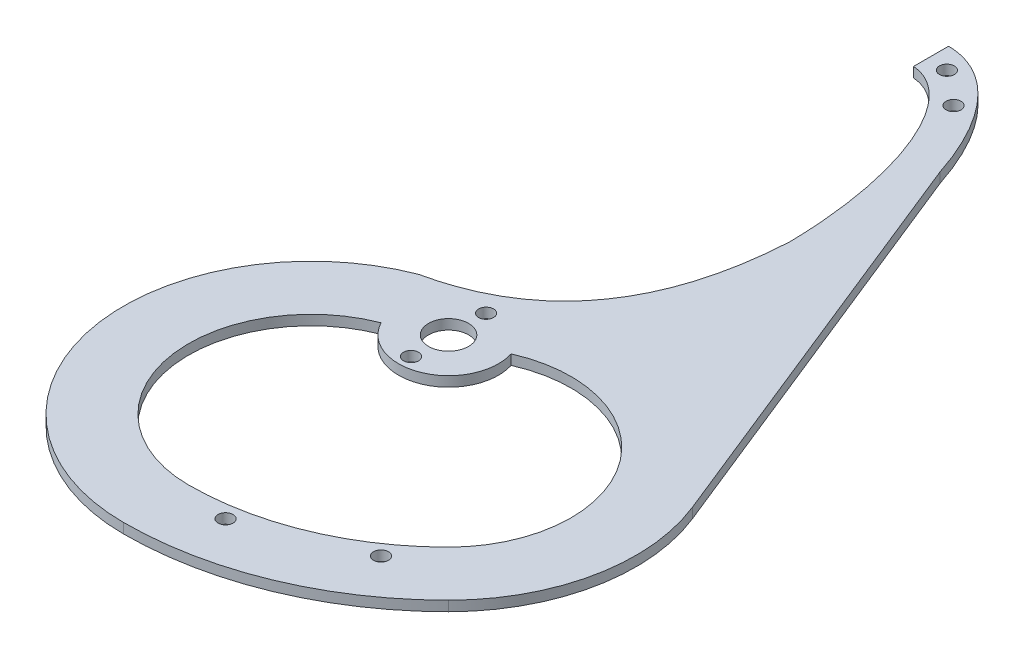
ISO-10303-21;
HEADER;
FILE_DESCRIPTION(('STEP AP214'),'2;1');
FILE_NAME('part.step','',(''),(''),'','','');
FILE_SCHEMA(('AUTOMOTIVE_DESIGN { 1 0 10303 214 1 1 1 1 }'));
ENDSEC;
DATA;
#1=APPLICATION_CONTEXT('core data for automotive mechanical design processes');
#2=APPLICATION_PROTOCOL_DEFINITION('international standard','automotive_design',2000,#1);
#3=PRODUCT_CONTEXT('',#1,'mechanical');
#4=PRODUCT('Part','Part','',(#3));
#5=PRODUCT_RELATED_PRODUCT_CATEGORY('part','',(#4));
#6=PRODUCT_DEFINITION_FORMATION('','',#4);
#7=PRODUCT_DEFINITION_CONTEXT('part definition',#1,'design');
#8=PRODUCT_DEFINITION('design','',#6,#7);
#9=PRODUCT_DEFINITION_SHAPE('','',#8);
#10=(LENGTH_UNIT() NAMED_UNIT(*) SI_UNIT(.MILLI.,.METRE.));
#11=(NAMED_UNIT(*) PLANE_ANGLE_UNIT() SI_UNIT($,.RADIAN.));
#12=(NAMED_UNIT(*) SI_UNIT($,.STERADIAN.) SOLID_ANGLE_UNIT());
#13=UNCERTAINTY_MEASURE_WITH_UNIT(LENGTH_MEASURE(1.E-05),#10,'distance_accuracy_value','');
#14=(GEOMETRIC_REPRESENTATION_CONTEXT(3) GLOBAL_UNCERTAINTY_ASSIGNED_CONTEXT((#13)) GLOBAL_UNIT_ASSIGNED_CONTEXT((#10,
#11,#12)) REPRESENTATION_CONTEXT('',''));
#15=CARTESIAN_POINT('',(0.,0.,0.));
#16=DIRECTION('',(0.,0.,1.));
#17=DIRECTION('',(1.,0.,0.));
#18=AXIS2_PLACEMENT_3D('',#15,#16,#17);
#19=CARTESIAN_POINT('',(0.,2.,27.5));
#20=DIRECTION('',(0.,1.,0.));
#21=DIRECTION('',(0.,0.,1.));
#22=AXIS2_PLACEMENT_3D('',#19,#20,#21);
#23=PLANE('',#22);
#24=CARTESIAN_POINT('',(10.7802293046451,2.,-90.2323634821783));
#25=DIRECTION('',(0.,-1.,0.));
#26=DIRECTION('',(0.,0.,-1.));
#27=AXIS2_PLACEMENT_3D('',#24,#25,#26);
#28=CIRCLE('',#27,1.5);
#29=CARTESIAN_POINT('',(10.7802293046451,2.,-91.7323634821783));
#30=VERTEX_POINT('',#29);
#31=EDGE_CURVE('E473',#30,#30,#28,.T.);
#32=ORIENTED_EDGE('',*,*,#31,.T.);
#33=EDGE_LOOP('',(#32));
#34=FACE_BOUND('',#33,.T.);
#35=CARTESIAN_POINT('',(3.99729247476001,2.,-95.6892620559412));
#36=DIRECTION('',(0.,-1.,0.));
#37=DIRECTION('',(0.,0.,-1.));
#38=AXIS2_PLACEMENT_3D('',#35,#36,#37);
#39=CIRCLE('',#38,1.5);
#40=CARTESIAN_POINT('',(3.99729247476001,2.,-97.1892620559412));
#41=VERTEX_POINT('',#40);
#42=EDGE_CURVE('E481',#41,#41,#39,.T.);
#43=ORIENTED_EDGE('',*,*,#42,.T.);
#44=EDGE_LOOP('',(#43));
#45=FACE_BOUND('',#44,.T.);
#46=CARTESIAN_POINT('',(0.,2.,7.5));
#47=DIRECTION('',(0.,1.,0.));
#48=DIRECTION('',(0.,0.,1.));
#49=AXIS2_PLACEMENT_3D('',#46,#47,#48);
#50=CIRCLE('',#49,1.5);
#51=CARTESIAN_POINT('',(0.,2.,9.));
#52=VERTEX_POINT('',#51);
#53=EDGE_CURVE('E493',#52,#52,#50,.T.);
#54=ORIENTED_EDGE('',*,*,#53,.F.);
#55=EDGE_LOOP('',(#54));
#56=FACE_BOUND('',#55,.T.);
#57=CARTESIAN_POINT('',(0.,2.,0.));
#58=DIRECTION('',(0.,1.,0.));
#59=DIRECTION('',(0.,0.,1.));
#60=AXIS2_PLACEMENT_3D('',#57,#58,#59);
#61=CIRCLE('',#60,52.);
#62=CARTESIAN_POINT('',(0.,2.,52.));
#63=VERTEX_POINT('',#62);
#64=CARTESIAN_POINT('',(36.7695526217005,2.,36.7695526217005));
#65=VERTEX_POINT('',#64);
#66=EDGE_CURVE('E132',#63,#65,#61,.T.);
#67=ORIENTED_EDGE('',*,*,#66,.F.);
#68=CARTESIAN_POINT('',(0.,2.,27.5));
#69=DIRECTION('',(0.,1.,0.));
#70=DIRECTION('',(0.,0.,-1.));
#71=AXIS2_PLACEMENT_3D('',#68,#69,#70);
#72=CIRCLE('',#71,24.5);
#73=CARTESIAN_POINT('',(-8.85071785854508,2.,4.65454545454543));
#74=VERTEX_POINT('',#73);
#75=EDGE_CURVE('E124',#74,#63,#72,.T.);
#76=ORIENTED_EDGE('',*,*,#75,.F.);
#77=CARTESIAN_POINT('',(0.,2.,0.));
#78=DIRECTION('',(0.,-1.,0.));
#79=DIRECTION('',(0.,0.,1.));
#80=AXIS2_PLACEMENT_3D('',#77,#78,#79);
#81=CIRCLE('',#80,9.99999999999992);
#82=CARTESIAN_POINT('',(9.54966327039619,2.,-2.96714196189605));
#83=VERTEX_POINT('',#82);
#84=EDGE_CURVE('E147',#83,#74,#81,.T.);
#85=ORIENTED_EDGE('',*,*,#84,.F.);
#86=CARTESIAN_POINT('',(19.4454364826301,2.,19.44543648263));
#87=DIRECTION('',(0.,1.,0.));
#88=DIRECTION('',(0.,0.,1.));
#89=AXIS2_PLACEMENT_3D('',#86,#87,#88);
#90=CIRCLE('',#89,24.5);
#91=EDGE_CURVE('E145',#65,#83,#90,.T.);
#92=ORIENTED_EDGE('',*,*,#91,.F.);
#93=EDGE_LOOP('',(#67,#76,#85,#92));
#94=FACE_BOUND('',#93,.T.);
#95=CARTESIAN_POINT('',(31.5467039993079,2.,45.0533624358943));
#96=DIRECTION('',(0.,1.,0.));
#97=DIRECTION('',(0.,0.,-1.));
#98=AXIS2_PLACEMENT_3D('',#95,#96,#97);
#99=CIRCLE('',#98,1.5);
#100=CARTESIAN_POINT('',(31.5467039993079,2.,43.5533624358943));
#101=VERTEX_POINT('',#100);
#102=EDGE_CURVE('E163',#101,#101,#99,.T.);
#103=ORIENTED_EDGE('',*,*,#102,.F.);
#104=EDGE_LOOP('',(#103));
#105=FACE_BOUND('',#104,.T.);
#106=CARTESIAN_POINT('',(0.,2.,27.5));
#107=DIRECTION('',(0.,1.,0.));
#108=DIRECTION('',(0.,0.,1.));
#109=AXIS2_PLACEMENT_3D('',#106,#107,#108);
#110=CIRCLE('',#109,37.5);
#111=CARTESIAN_POINT('',(-13.452394345634,2.,-7.50404385738234));
#112=VERTEX_POINT('',#111);
#113=CARTESIAN_POINT('',(0.,2.,64.9999999999999));
#114=VERTEX_POINT('',#113);
#115=EDGE_CURVE('E175',#112,#114,#110,.T.);
#116=ORIENTED_EDGE('',*,*,#115,.T.);
#117=CARTESIAN_POINT('',(0.,2.,0.));
#118=DIRECTION('',(0.,1.,0.));
#119=DIRECTION('',(0.,0.,-1.));
#120=AXIS2_PLACEMENT_3D('',#117,#118,#119);
#121=CIRCLE('',#120,64.9999999999999);
#122=CARTESIAN_POINT('',(45.9619407771256,2.,45.9619407771255));
#123=VERTEX_POINT('',#122);
#124=EDGE_CURVE('E178',#114,#123,#121,.T.);
#125=ORIENTED_EDGE('',*,*,#124,.T.);
#126=CARTESIAN_POINT('',(19.4454364826301,2.,19.44543648263));
#127=DIRECTION('',(0.,1.,0.));
#128=DIRECTION('',(0.,0.,1.));
#129=AXIS2_PLACEMENT_3D('',#126,#127,#128);
#130=CIRCLE('',#129,37.4999999999999);
#131=CARTESIAN_POINT('',(54.2360333928099,2.,5.45028136975691));
#132=VERTEX_POINT('',#131);
#133=EDGE_CURVE('E181',#123,#132,#130,.T.);
#134=ORIENTED_EDGE('',*,*,#133,.T.);
#135=DIRECTION('',(-0.373204136343284,0.,-0.927749250938131));
#136=VECTOR('',#135,1.);
#137=CARTESIAN_POINT('',(54.2360333928099,2.,5.45028136975693));
#138=LINE('',#137,#136);
#139=CARTESIAN_POINT('',(20.9205105577853,2.,-77.3688740063126));
#140=VERTEX_POINT('',#139);
#141=EDGE_CURVE('E183',#132,#140,#138,.T.);
#142=ORIENTED_EDGE('',*,*,#141,.T.);
#143=CARTESIAN_POINT('',(0.,2.,-50.));
#144=DIRECTION('',(0.,1.,0.));
#145=DIRECTION('',(-7.96719733301985E-05,0.,-0.999999996826188));
#146=AXIS2_PLACEMENT_3D('',#143,#144,#145);
#147=ELLIPSE('',#146,50.0000004760718,25.0000000793453);
#148=CARTESIAN_POINT('',(0.,2.,-100.));
#149=VERTEX_POINT('',#148);
#150=EDGE_CURVE('E185',#140,#149,#147,.T.);
#151=ORIENTED_EDGE('',*,*,#150,.T.);
#152=DIRECTION('',(0.,0.,1.));
#153=VECTOR('',#152,1.);
#154=CARTESIAN_POINT('',(0.,2.,-93.0000000000292));
#155=LINE('',#154,#153);
#156=CARTESIAN_POINT('',(0.,2.,-93.0000000000292));
#157=VERTEX_POINT('',#156);
#158=EDGE_CURVE('E188',#149,#157,#155,.T.);
#159=ORIENTED_EDGE('',*,*,#158,.T.);
#160=CARTESIAN_POINT('',(0.,2.,-50.));
#161=DIRECTION('',(0.,-1.,0.));
#162=DIRECTION('',(0.0150081111125312,0.,0.999887371957879));
#163=AXIS2_PLACEMENT_3D('',#160,#161,#162);
#164=ELLIPSE('',#163,43.0227949668845,18.007170315413);
#165=CARTESIAN_POINT('',(18.0051422030762,2.,-50.270253612916));
#166=VERTEX_POINT('',#165);
#167=EDGE_CURVE('E238',#157,#166,#164,.T.);
#168=ORIENTED_EDGE('',*,*,#167,.T.);
#169=CARTESIAN_POINT('',(18.0051422030762,2.,-50.270253612916));
#170=CARTESIAN_POINT('',(16.0032644047017,2.,-13.8457323384157));
#171=CARTESIAN_POINT('',(-13.452394345634,2.,-7.50404385738234));
#172=B_SPLINE_CURVE_WITH_KNOTS('',2,(#169,#170,#171),.UNSPECIFIED.,.F.,.F.,(3,3),(0.,1.),.UNSPECIFIED.);
#173=EDGE_CURVE('E232',#166,#112,#172,.T.);
#174=ORIENTED_EDGE('',*,*,#173,.T.);
#175=EDGE_LOOP('',(#116,#125,#134,#142,#151,#159,#168,#174));
#176=FACE_BOUND('',#175,.T.);
#177=CARTESIAN_POINT('',(9.55064977168081,2.,54.1644264156715));
#178=DIRECTION('',(0.,1.,0.));
#179=DIRECTION('',(0.,0.,1.));
#180=AXIS2_PLACEMENT_3D('',#177,#178,#179);
#181=CIRCLE('',#180,1.5);
#182=CARTESIAN_POINT('',(9.55064977168081,2.,55.6644264156715));
#183=VERTEX_POINT('',#182);
#184=EDGE_CURVE('E169',#183,#183,#181,.T.);
#185=ORIENTED_EDGE('',*,*,#184,.F.);
#186=EDGE_LOOP('',(#185));
#187=FACE_BOUND('',#186,.T.);
#188=CARTESIAN_POINT('',(0.,2.,0.));
#189=DIRECTION('',(0.,1.,0.));
#190=DIRECTION('',(0.,0.,1.));
#191=AXIS2_PLACEMENT_3D('',#188,#189,#190);
#192=CIRCLE('',#191,4.);
#193=CARTESIAN_POINT('',(0.,2.,4.));
#194=VERTEX_POINT('',#193);
#195=EDGE_CURVE('E153',#194,#194,#192,.T.);
#196=ORIENTED_EDGE('',*,*,#195,.F.);
#197=EDGE_LOOP('',(#196));
#198=FACE_BOUND('',#197,.T.);
#199=CARTESIAN_POINT('',(0.,2.,-7.5));
#200=DIRECTION('',(0.,1.,0.));
#201=DIRECTION('',(0.,0.,1.));
#202=AXIS2_PLACEMENT_3D('',#199,#200,#201);
#203=CIRCLE('',#202,1.5);
#204=CARTESIAN_POINT('',(0.,2.,-6.));
#205=VERTEX_POINT('',#204);
#206=EDGE_CURVE('E487',#205,#205,#203,.T.);
#207=ORIENTED_EDGE('',*,*,#206,.F.);
#208=EDGE_LOOP('',(#207));
#209=FACE_BOUND('',#208,.T.);
#210=ADVANCED_FACE('F35',(#34,#45,#56,#94,#105,#176,#187,#198,#209),#23,.T.);
#211=CARTESIAN_POINT('',(0.,0.,27.5));
#212=DIRECTION('',(0.,1.,0.));
#213=DIRECTION('',(0.,0.,1.));
#214=AXIS2_PLACEMENT_3D('',#211,#212,#213);
#215=PLANE('',#214);
#216=CARTESIAN_POINT('',(10.7802293046451,0.,-90.2323634821783));
#217=DIRECTION('',(0.,-1.,0.));
#218=DIRECTION('',(0.,0.,-1.));
#219=AXIS2_PLACEMENT_3D('',#216,#217,#218);
#220=CIRCLE('',#219,1.5);
#221=CARTESIAN_POINT('',(10.7802293046451,0.,-91.7323634821783));
#222=VERTEX_POINT('',#221);
#223=EDGE_CURVE('E476',#222,#222,#220,.T.);
#224=ORIENTED_EDGE('',*,*,#223,.F.);
#225=EDGE_LOOP('',(#224));
#226=FACE_BOUND('',#225,.T.);
#227=CARTESIAN_POINT('',(3.99729247476001,0.,-95.6892620559412));
#228=DIRECTION('',(0.,-1.,0.));
#229=DIRECTION('',(0.,0.,-1.));
#230=AXIS2_PLACEMENT_3D('',#227,#228,#229);
#231=CIRCLE('',#230,1.5);
#232=CARTESIAN_POINT('',(3.99729247476001,0.,-97.1892620559412));
#233=VERTEX_POINT('',#232);
#234=EDGE_CURVE('E478',#233,#233,#231,.T.);
#235=ORIENTED_EDGE('',*,*,#234,.F.);
#236=EDGE_LOOP('',(#235));
#237=FACE_BOUND('',#236,.T.);
#238=CARTESIAN_POINT('',(31.5467039993079,0.,45.0533624358943));
#239=DIRECTION('',(0.,1.,0.));
#240=DIRECTION('',(0.,0.,-1.));
#241=AXIS2_PLACEMENT_3D('',#238,#239,#240);
#242=CIRCLE('',#241,1.5);
#243=CARTESIAN_POINT('',(31.5467039993079,0.,43.5533624358943));
#244=VERTEX_POINT('',#243);
#245=EDGE_CURVE('E140',#244,#244,#242,.T.);
#246=ORIENTED_EDGE('',*,*,#245,.T.);
#247=EDGE_LOOP('',(#246));
#248=FACE_BOUND('',#247,.T.);
#249=CARTESIAN_POINT('',(9.55064977168081,0.,54.1644264156715));
#250=DIRECTION('',(0.,1.,0.));
#251=DIRECTION('',(0.,0.,1.));
#252=AXIS2_PLACEMENT_3D('',#249,#250,#251);
#253=CIRCLE('',#252,1.5);
#254=CARTESIAN_POINT('',(9.55064977168081,0.,55.6644264156715));
#255=VERTEX_POINT('',#254);
#256=EDGE_CURVE('E166',#255,#255,#253,.T.);
#257=ORIENTED_EDGE('',*,*,#256,.T.);
#258=EDGE_LOOP('',(#257));
#259=FACE_BOUND('',#258,.T.);
#260=CARTESIAN_POINT('',(0.,0.,27.5));
#261=DIRECTION('',(0.,1.,0.));
#262=DIRECTION('',(0.,0.,1.));
#263=AXIS2_PLACEMENT_3D('',#260,#261,#262);
#264=CIRCLE('',#263,37.5);
#265=CARTESIAN_POINT('',(-13.452394345634,0.,-7.50404385738234));
#266=VERTEX_POINT('',#265);
#267=CARTESIAN_POINT('',(0.,0.,64.9999999999999));
#268=VERTEX_POINT('',#267);
#269=EDGE_CURVE('E172',#266,#268,#264,.T.);
#270=ORIENTED_EDGE('',*,*,#269,.F.);
#271=CARTESIAN_POINT('',(18.0051422030762,0.,-50.270253612916));
#272=CARTESIAN_POINT('',(16.0032644047017,0.,-13.8457323384157));
#273=CARTESIAN_POINT('',(-13.452394345634,0.,-7.50404385738234));
#274=B_SPLINE_CURVE_WITH_KNOTS('',2,(#271,#272,#273),.UNSPECIFIED.,.F.,.F.,(3,3),(0.,1.),.UNSPECIFIED.);
#275=CARTESIAN_POINT('',(18.0051422030762,0.,-50.270253612916));
#276=VERTEX_POINT('',#275);
#277=EDGE_CURVE('E179',#276,#266,#274,.T.);
#278=ORIENTED_EDGE('',*,*,#277,.F.);
#279=CARTESIAN_POINT('',(0.,0.,-50.));
#280=DIRECTION('',(0.,-1.,0.));
#281=DIRECTION('',(0.0150081111125312,0.,0.999887371957879));
#282=AXIS2_PLACEMENT_3D('',#279,#280,#281);
#283=ELLIPSE('',#282,43.0227949668845,18.007170315413);
#284=CARTESIAN_POINT('',(0.,0.,-93.0000000000292));
#285=VERTEX_POINT('',#284);
#286=EDGE_CURVE('E255',#285,#276,#283,.T.);
#287=ORIENTED_EDGE('',*,*,#286,.F.);
#288=DIRECTION('',(0.,0.,1.));
#289=VECTOR('',#288,1.);
#290=CARTESIAN_POINT('',(0.,0.,-93.0000000000292));
#291=LINE('',#290,#289);
#292=CARTESIAN_POINT('',(0.,0.,-100.));
#293=VERTEX_POINT('',#292);
#294=EDGE_CURVE('E253',#293,#285,#291,.T.);
#295=ORIENTED_EDGE('',*,*,#294,.F.);
#296=CARTESIAN_POINT('',(0.,0.,-50.));
#297=DIRECTION('',(0.,1.,0.));
#298=DIRECTION('',(-7.96719733301985E-05,0.,-0.999999996826188));
#299=AXIS2_PLACEMENT_3D('',#296,#297,#298);
#300=ELLIPSE('',#299,50.0000004760718,25.0000000793453);
#301=CARTESIAN_POINT('',(20.9205105577853,0.,-77.3688740063126));
#302=VERTEX_POINT('',#301);
#303=EDGE_CURVE('E251',#302,#293,#300,.T.);
#304=ORIENTED_EDGE('',*,*,#303,.F.);
#305=DIRECTION('',(-0.373204136343284,0.,-0.927749250938131));
#306=VECTOR('',#305,1.);
#307=CARTESIAN_POINT('',(54.2360333928099,0.,5.45028136975693));
#308=LINE('',#307,#306);
#309=CARTESIAN_POINT('',(54.2360333928099,0.,5.45028136975691));
#310=VERTEX_POINT('',#309);
#311=EDGE_CURVE('E249',#310,#302,#308,.T.);
#312=ORIENTED_EDGE('',*,*,#311,.F.);
#313=CARTESIAN_POINT('',(19.4454364826301,0.,19.44543648263));
#314=DIRECTION('',(0.,1.,0.));
#315=DIRECTION('',(0.,0.,1.));
#316=AXIS2_PLACEMENT_3D('',#313,#314,#315);
#317=CIRCLE('',#316,37.4999999999999);
#318=CARTESIAN_POINT('',(45.9619407771256,0.,45.9619407771255));
#319=VERTEX_POINT('',#318);
#320=EDGE_CURVE('E247',#319,#310,#317,.T.);
#321=ORIENTED_EDGE('',*,*,#320,.F.);
#322=CARTESIAN_POINT('',(0.,0.,0.));
#323=DIRECTION('',(0.,1.,0.));
#324=DIRECTION('',(0.,0.,-1.));
#325=AXIS2_PLACEMENT_3D('',#322,#323,#324);
#326=CIRCLE('',#325,64.9999999999999);
#327=EDGE_CURVE('E245',#268,#319,#326,.T.);
#328=ORIENTED_EDGE('',*,*,#327,.F.);
#329=EDGE_LOOP('',(#270,#278,#287,#295,#304,#312,#321,#328));
#330=FACE_BOUND('',#329,.T.);
#331=CARTESIAN_POINT('',(0.,0.,27.5));
#332=DIRECTION('',(0.,1.,0.));
#333=DIRECTION('',(0.,0.,-1.));
#334=AXIS2_PLACEMENT_3D('',#331,#332,#333);
#335=CIRCLE('',#334,24.5);
#336=CARTESIAN_POINT('',(-8.85071785854508,0.,4.65454545454543));
#337=VERTEX_POINT('',#336);
#338=CARTESIAN_POINT('',(0.,0.,52.));
#339=VERTEX_POINT('',#338);
#340=EDGE_CURVE('E58',#337,#339,#335,.T.);
#341=ORIENTED_EDGE('',*,*,#340,.T.);
#342=CARTESIAN_POINT('',(0.,0.,0.));
#343=DIRECTION('',(0.,1.,0.));
#344=DIRECTION('',(0.,0.,1.));
#345=AXIS2_PLACEMENT_3D('',#342,#343,#344);
#346=CIRCLE('',#345,52.);
#347=CARTESIAN_POINT('',(36.7695526217005,0.,36.7695526217005));
#348=VERTEX_POINT('',#347);
#349=EDGE_CURVE('E139',#339,#348,#346,.T.);
#350=ORIENTED_EDGE('',*,*,#349,.T.);
#351=CARTESIAN_POINT('',(19.4454364826301,0.,19.44543648263));
#352=DIRECTION('',(0.,1.,0.));
#353=DIRECTION('',(0.,0.,1.));
#354=AXIS2_PLACEMENT_3D('',#351,#352,#353);
#355=CIRCLE('',#354,24.5);
#356=CARTESIAN_POINT('',(9.5496632703962,0.,-2.96714196189605));
#357=VERTEX_POINT('',#356);
#358=EDGE_CURVE('E155',#348,#357,#355,.T.);
#359=ORIENTED_EDGE('',*,*,#358,.T.);
#360=CARTESIAN_POINT('',(0.,0.,0.));
#361=DIRECTION('',(0.,-1.,0.));
#362=DIRECTION('',(0.,0.,1.));
#363=AXIS2_PLACEMENT_3D('',#360,#361,#362);
#364=CIRCLE('',#363,9.99999999999992);
#365=EDGE_CURVE('E133',#357,#337,#364,.T.);
#366=ORIENTED_EDGE('',*,*,#365,.T.);
#367=EDGE_LOOP('',(#341,#350,#359,#366));
#368=FACE_BOUND('',#367,.T.);
#369=CARTESIAN_POINT('',(0.,0.,0.));
#370=DIRECTION('',(0.,1.,0.));
#371=DIRECTION('',(0.,0.,1.));
#372=AXIS2_PLACEMENT_3D('',#369,#370,#371);
#373=CIRCLE('',#372,4.);
#374=CARTESIAN_POINT('',(0.,0.,4.));
#375=VERTEX_POINT('',#374);
#376=EDGE_CURVE('E496',#375,#375,#373,.T.);
#377=ORIENTED_EDGE('',*,*,#376,.T.);
#378=EDGE_LOOP('',(#377));
#379=FACE_BOUND('',#378,.T.);
#380=CARTESIAN_POINT('',(0.,0.,7.5));
#381=DIRECTION('',(0.,1.,0.));
#382=DIRECTION('',(0.,0.,1.));
#383=AXIS2_PLACEMENT_3D('',#380,#381,#382);
#384=CIRCLE('',#383,1.5);
#385=CARTESIAN_POINT('',(0.,0.,9.));
#386=VERTEX_POINT('',#385);
#387=EDGE_CURVE('E490',#386,#386,#384,.T.);
#388=ORIENTED_EDGE('',*,*,#387,.T.);
#389=EDGE_LOOP('',(#388));
#390=FACE_BOUND('',#389,.T.);
#391=CARTESIAN_POINT('',(0.,0.,-7.5));
#392=DIRECTION('',(0.,1.,0.));
#393=DIRECTION('',(0.,0.,1.));
#394=AXIS2_PLACEMENT_3D('',#391,#392,#393);
#395=CIRCLE('',#394,1.5);
#396=CARTESIAN_POINT('',(0.,0.,-6.));
#397=VERTEX_POINT('',#396);
#398=EDGE_CURVE('E484',#397,#397,#395,.T.);
#399=ORIENTED_EDGE('',*,*,#398,.T.);
#400=EDGE_LOOP('',(#399));
#401=FACE_BOUND('',#400,.T.);
#402=ADVANCED_FACE('F211',(#226,#237,#248,#259,#330,#368,#379,#390,#401),#215,.F.);
#403=CARTESIAN_POINT('',(0.,2.,27.5));
#404=DIRECTION('',(0.,-1.,0.));
#405=DIRECTION('',(0.,0.,-1.));
#406=AXIS2_PLACEMENT_3D('',#403,#404,#405);
#407=CYLINDRICAL_SURFACE('',#406,37.5);
#408=ORIENTED_EDGE('',*,*,#269,.T.);
#409=DIRECTION('',(0.,-1.,0.));
#410=VECTOR('',#409,1.);
#411=CARTESIAN_POINT('',(0.,2.,64.9999999999999));
#412=LINE('',#411,#410);
#413=EDGE_CURVE('E11',#114,#268,#412,.T.);
#414=ORIENTED_EDGE('',*,*,#413,.F.);
#415=ORIENTED_EDGE('',*,*,#115,.F.);
#416=DIRECTION('',(0.,-1.,0.));
#417=VECTOR('',#416,1.);
#418=CARTESIAN_POINT('',(-13.452394345634,2.,-7.50404385738234));
#419=LINE('',#418,#417);
#420=EDGE_CURVE('E237',#112,#266,#419,.T.);
#421=ORIENTED_EDGE('',*,*,#420,.T.);
#422=EDGE_LOOP('',(#408,#414,#415,#421));
#423=FACE_BOUND('',#422,.T.);
#424=ADVANCED_FACE('F37',(#423),#407,.T.);
#425=CARTESIAN_POINT('',(0.,2.,0.));
#426=DIRECTION('',(0.,-1.,0.));
#427=DIRECTION('',(0.,0.,-1.));
#428=AXIS2_PLACEMENT_3D('',#425,#426,#427);
#429=CYLINDRICAL_SURFACE('',#428,64.9999999999999);
#430=ORIENTED_EDGE('',*,*,#327,.T.);
#431=DIRECTION('',(0.,-1.,0.));
#432=VECTOR('',#431,1.);
#433=CARTESIAN_POINT('',(45.9619407771256,2.,45.9619407771255));
#434=LINE('',#433,#432);
#435=EDGE_CURVE('E43',#123,#319,#434,.T.);
#436=ORIENTED_EDGE('',*,*,#435,.F.);
#437=ORIENTED_EDGE('',*,*,#124,.F.);
#438=ORIENTED_EDGE('',*,*,#413,.T.);
#439=EDGE_LOOP('',(#430,#436,#437,#438));
#440=FACE_BOUND('',#439,.T.);
#441=ADVANCED_FACE('F204',(#440),#429,.T.);
#442=CARTESIAN_POINT('',(19.4454364826301,2.,19.44543648263));
#443=DIRECTION('',(0.,-1.,0.));
#444=DIRECTION('',(0.,0.,-1.));
#445=AXIS2_PLACEMENT_3D('',#442,#443,#444);
#446=CYLINDRICAL_SURFACE('',#445,37.4999999999999);
#447=ORIENTED_EDGE('',*,*,#320,.T.);
#448=DIRECTION('',(0.,-1.,0.));
#449=VECTOR('',#448,1.);
#450=CARTESIAN_POINT('',(54.2360333928099,2.,5.45028136975691));
#451=LINE('',#450,#449);
#452=EDGE_CURVE('E277',#132,#310,#451,.T.);
#453=ORIENTED_EDGE('',*,*,#452,.F.);
#454=ORIENTED_EDGE('',*,*,#133,.F.);
#455=ORIENTED_EDGE('',*,*,#435,.T.);
#456=EDGE_LOOP('',(#447,#453,#454,#455));
#457=FACE_BOUND('',#456,.T.);
#458=ADVANCED_FACE('F201',(#457),#446,.T.);
#459=CARTESIAN_POINT('',(54.2360333928099,2.,5.45028136975693));
#460=DIRECTION('',(-0.927749250938131,0.,0.373204136343284));
#461=DIRECTION('',(0.373204136343284,0.,0.927749250938131));
#462=AXIS2_PLACEMENT_3D('',#459,#460,#461);
#463=PLANE('',#462);
#464=ORIENTED_EDGE('',*,*,#311,.T.);
#465=DIRECTION('',(0.,-1.,0.));
#466=VECTOR('',#465,1.);
#467=CARTESIAN_POINT('',(20.9205105577853,2.,-77.3688740063126));
#468=LINE('',#467,#466);
#469=EDGE_CURVE('E274',#140,#302,#468,.T.);
#470=ORIENTED_EDGE('',*,*,#469,.F.);
#471=ORIENTED_EDGE('',*,*,#141,.F.);
#472=ORIENTED_EDGE('',*,*,#452,.T.);
#473=EDGE_LOOP('',(#464,#470,#471,#472));
#474=FACE_BOUND('',#473,.T.);
#475=ADVANCED_FACE('F196',(#474),#463,.F.);
#476=DIRECTION('',(0.,-1.,0.));
#477=VECTOR('',#476,1.);
#478=SURFACE_OF_LINEAR_EXTRUSION('',#147,#477);
#479=ORIENTED_EDGE('',*,*,#303,.T.);
#480=DIRECTION('',(0.,-1.,0.));
#481=VECTOR('',#480,1.);
#482=CARTESIAN_POINT('',(0.,2.,-100.));
#483=LINE('',#482,#481);
#484=EDGE_CURVE('E271',#149,#293,#483,.T.);
#485=ORIENTED_EDGE('',*,*,#484,.F.);
#486=ORIENTED_EDGE('',*,*,#150,.F.);
#487=ORIENTED_EDGE('',*,*,#469,.T.);
#488=EDGE_LOOP('',(#479,#485,#486,#487));
#489=FACE_BOUND('',#488,.T.);
#490=ADVANCED_FACE('F191',(#489),#478,.F.);
#491=CARTESIAN_POINT('',(0.,2.,-93.0000000000292));
#492=DIRECTION('',(1.,0.,0.));
#493=DIRECTION('',(0.,0.,-1.));
#494=AXIS2_PLACEMENT_3D('',#491,#492,#493);
#495=PLANE('',#494);
#496=ORIENTED_EDGE('',*,*,#294,.T.);
#497=DIRECTION('',(0.,-1.,0.));
#498=VECTOR('',#497,1.);
#499=CARTESIAN_POINT('',(0.,2.,-93.0000000000292));
#500=LINE('',#499,#498);
#501=EDGE_CURVE('E268',#157,#285,#500,.T.);
#502=ORIENTED_EDGE('',*,*,#501,.F.);
#503=ORIENTED_EDGE('',*,*,#158,.F.);
#504=ORIENTED_EDGE('',*,*,#484,.T.);
#505=EDGE_LOOP('',(#496,#502,#503,#504));
#506=FACE_BOUND('',#505,.T.);
#507=ADVANCED_FACE('F195',(#506),#495,.F.);
#508=DIRECTION('',(0.,-1.,0.));
#509=VECTOR('',#508,1.);
#510=SURFACE_OF_LINEAR_EXTRUSION('',#164,#509);
#511=ORIENTED_EDGE('',*,*,#286,.T.);
#512=DIRECTION('',(0.,-1.,0.));
#513=VECTOR('',#512,1.);
#514=CARTESIAN_POINT('',(18.0051422030762,2.,-50.270253612916));
#515=LINE('',#514,#513);
#516=EDGE_CURVE('E265',#166,#276,#515,.T.);
#517=ORIENTED_EDGE('',*,*,#516,.F.);
#518=ORIENTED_EDGE('',*,*,#167,.F.);
#519=ORIENTED_EDGE('',*,*,#501,.T.);
#520=EDGE_LOOP('',(#511,#517,#518,#519));
#521=FACE_BOUND('',#520,.T.);
#522=ADVANCED_FACE('F230',(#521),#510,.F.);
#523=DIRECTION('',(0.,-1.,0.));
#524=VECTOR('',#523,1.);
#525=SURFACE_OF_LINEAR_EXTRUSION('',#172,#524);
#526=ORIENTED_EDGE('',*,*,#277,.T.);
#527=ORIENTED_EDGE('',*,*,#420,.F.);
#528=ORIENTED_EDGE('',*,*,#173,.F.);
#529=ORIENTED_EDGE('',*,*,#516,.T.);
#530=EDGE_LOOP('',(#526,#527,#528,#529));
#531=FACE_BOUND('',#530,.T.);
#532=ADVANCED_FACE('F227',(#531),#525,.F.);
#533=CARTESIAN_POINT('',(9.55064977168081,2.,54.1644264156715));
#534=DIRECTION('',(0.,-1.,0.));
#535=DIRECTION('',(0.,0.,-1.));
#536=AXIS2_PLACEMENT_3D('',#533,#534,#535);
#537=CYLINDRICAL_SURFACE('',#536,1.5);
#538=ORIENTED_EDGE('',*,*,#184,.T.);
#539=EDGE_LOOP('',(#538));
#540=FACE_BOUND('',#539,.T.);
#541=ORIENTED_EDGE('',*,*,#256,.F.);
#542=EDGE_LOOP('',(#541));
#543=FACE_BOUND('',#542,.T.);
#544=ADVANCED_FACE('F224',(#540,#543),#537,.F.);
#545=CARTESIAN_POINT('',(31.5467039993079,2.,45.0533624358943));
#546=DIRECTION('',(0.,-1.,0.));
#547=DIRECTION('',(0.,0.,-1.));
#548=AXIS2_PLACEMENT_3D('',#545,#546,#547);
#549=CYLINDRICAL_SURFACE('',#548,1.5);
#550=ORIENTED_EDGE('',*,*,#102,.T.);
#551=EDGE_LOOP('',(#550));
#552=FACE_BOUND('',#551,.T.);
#553=ORIENTED_EDGE('',*,*,#245,.F.);
#554=EDGE_LOOP('',(#553));
#555=FACE_BOUND('',#554,.T.);
#556=ADVANCED_FACE('F324',(#552,#555),#549,.F.);
#557=CARTESIAN_POINT('',(0.,2.,27.5));
#558=DIRECTION('',(0.,-1.,0.));
#559=DIRECTION('',(0.,0.,-1.));
#560=AXIS2_PLACEMENT_3D('',#557,#558,#559);
#561=CYLINDRICAL_SURFACE('',#560,24.5);
#562=ORIENTED_EDGE('',*,*,#340,.F.);
#563=DIRECTION('',(0.,-1.,0.));
#564=VECTOR('',#563,1.);
#565=CARTESIAN_POINT('',(-8.85071785854508,2.,4.65454545454543));
#566=LINE('',#565,#564);
#567=EDGE_CURVE('E128',#74,#337,#566,.T.);
#568=ORIENTED_EDGE('',*,*,#567,.F.);
#569=ORIENTED_EDGE('',*,*,#75,.T.);
#570=DIRECTION('',(0.,-1.,0.));
#571=VECTOR('',#570,1.);
#572=CARTESIAN_POINT('',(0.,2.,52.));
#573=LINE('',#572,#571);
#574=EDGE_CURVE('E127',#63,#339,#573,.T.);
#575=ORIENTED_EDGE('',*,*,#574,.T.);
#576=EDGE_LOOP('',(#562,#568,#569,#575));
#577=FACE_BOUND('',#576,.T.);
#578=ADVANCED_FACE('F126',(#577),#561,.F.);
#579=CARTESIAN_POINT('',(0.,2.,0.));
#580=DIRECTION('',(0.,-1.,0.));
#581=DIRECTION('',(0.,0.,-1.));
#582=AXIS2_PLACEMENT_3D('',#579,#580,#581);
#583=CYLINDRICAL_SURFACE('',#582,52.);
#584=ORIENTED_EDGE('',*,*,#349,.F.);
#585=ORIENTED_EDGE('',*,*,#574,.F.);
#586=ORIENTED_EDGE('',*,*,#66,.T.);
#587=DIRECTION('',(0.,-1.,0.));
#588=VECTOR('',#587,1.);
#589=CARTESIAN_POINT('',(36.7695526217005,2.,36.7695526217005));
#590=LINE('',#589,#588);
#591=EDGE_CURVE('E141',#65,#348,#590,.T.);
#592=ORIENTED_EDGE('',*,*,#591,.T.);
#593=EDGE_LOOP('',(#584,#585,#586,#592));
#594=FACE_BOUND('',#593,.T.);
#595=ADVANCED_FACE('F136',(#594),#583,.F.);
#596=CARTESIAN_POINT('',(19.4454364826301,2.,19.44543648263));
#597=DIRECTION('',(0.,-1.,0.));
#598=DIRECTION('',(0.,0.,-1.));
#599=AXIS2_PLACEMENT_3D('',#596,#597,#598);
#600=CYLINDRICAL_SURFACE('',#599,24.5);
#601=ORIENTED_EDGE('',*,*,#358,.F.);
#602=ORIENTED_EDGE('',*,*,#591,.F.);
#603=ORIENTED_EDGE('',*,*,#91,.T.);
#604=DIRECTION('',(0.,-1.,0.));
#605=VECTOR('',#604,1.);
#606=CARTESIAN_POINT('',(9.5496632703962,2.,-2.96714196189605));
#607=LINE('',#606,#605);
#608=EDGE_CURVE('E50',#83,#357,#607,.T.);
#609=ORIENTED_EDGE('',*,*,#608,.T.);
#610=EDGE_LOOP('',(#601,#602,#603,#609));
#611=FACE_BOUND('',#610,.T.);
#612=ADVANCED_FACE('F343',(#611),#600,.F.);
#613=CARTESIAN_POINT('',(0.,2.,0.));
#614=DIRECTION('',(0.,-1.,0.));
#615=DIRECTION('',(0.,0.,-1.));
#616=AXIS2_PLACEMENT_3D('',#613,#614,#615);
#617=CYLINDRICAL_SURFACE('',#616,9.99999999999992);
#618=ORIENTED_EDGE('',*,*,#365,.F.);
#619=ORIENTED_EDGE('',*,*,#608,.F.);
#620=ORIENTED_EDGE('',*,*,#84,.T.);
#621=ORIENTED_EDGE('',*,*,#567,.T.);
#622=EDGE_LOOP('',(#618,#619,#620,#621));
#623=FACE_BOUND('',#622,.T.);
#624=ADVANCED_FACE('F350',(#623),#617,.T.);
#625=CARTESIAN_POINT('',(0.,2.,0.));
#626=DIRECTION('',(0.,-1.,0.));
#627=DIRECTION('',(0.,0.,-1.));
#628=AXIS2_PLACEMENT_3D('',#625,#626,#627);
#629=CYLINDRICAL_SURFACE('',#628,4.);
#630=ORIENTED_EDGE('',*,*,#195,.T.);
#631=EDGE_LOOP('',(#630));
#632=FACE_BOUND('',#631,.T.);
#633=ORIENTED_EDGE('',*,*,#376,.F.);
#634=EDGE_LOOP('',(#633));
#635=FACE_BOUND('',#634,.T.);
#636=ADVANCED_FACE('F358',(#632,#635),#629,.F.);
#637=CARTESIAN_POINT('',(0.,2.,7.5));
#638=DIRECTION('',(0.,-1.,0.));
#639=DIRECTION('',(0.,0.,-1.));
#640=AXIS2_PLACEMENT_3D('',#637,#638,#639);
#641=CYLINDRICAL_SURFACE('',#640,1.5);
#642=ORIENTED_EDGE('',*,*,#53,.T.);
#643=EDGE_LOOP('',(#642));
#644=FACE_BOUND('',#643,.T.);
#645=ORIENTED_EDGE('',*,*,#387,.F.);
#646=EDGE_LOOP('',(#645));
#647=FACE_BOUND('',#646,.T.);
#648=ADVANCED_FACE('F365',(#644,#647),#641,.F.);
#649=CARTESIAN_POINT('',(0.,2.,-7.5));
#650=DIRECTION('',(0.,-1.,0.));
#651=DIRECTION('',(0.,0.,-1.));
#652=AXIS2_PLACEMENT_3D('',#649,#650,#651);
#653=CYLINDRICAL_SURFACE('',#652,1.5);
#654=ORIENTED_EDGE('',*,*,#206,.T.);
#655=EDGE_LOOP('',(#654));
#656=FACE_BOUND('',#655,.T.);
#657=ORIENTED_EDGE('',*,*,#398,.F.);
#658=EDGE_LOOP('',(#657));
#659=FACE_BOUND('',#658,.T.);
#660=ADVANCED_FACE('F373',(#656,#659),#653,.F.);
#661=CARTESIAN_POINT('',(3.99729247476001,2.,-95.6892620559412));
#662=DIRECTION('',(0.,-1.,0.));
#663=DIRECTION('',(0.,0.,-1.));
#664=AXIS2_PLACEMENT_3D('',#661,#662,#663);
#665=CYLINDRICAL_SURFACE('',#664,1.5);
#666=ORIENTED_EDGE('',*,*,#42,.F.);
#667=EDGE_LOOP('',(#666));
#668=FACE_BOUND('',#667,.T.);
#669=ORIENTED_EDGE('',*,*,#234,.T.);
#670=EDGE_LOOP('',(#669));
#671=FACE_BOUND('',#670,.T.);
#672=ADVANCED_FACE('F381',(#668,#671),#665,.F.);
#673=CARTESIAN_POINT('',(10.7802293046451,2.,-90.2323634821783));
#674=DIRECTION('',(0.,-1.,0.));
#675=DIRECTION('',(0.,0.,-1.));
#676=AXIS2_PLACEMENT_3D('',#673,#674,#675);
#677=CYLINDRICAL_SURFACE('',#676,1.5);
#678=ORIENTED_EDGE('',*,*,#31,.F.);
#679=EDGE_LOOP('',(#678));
#680=FACE_BOUND('',#679,.T.);
#681=ORIENTED_EDGE('',*,*,#223,.T.);
#682=EDGE_LOOP('',(#681));
#683=FACE_BOUND('',#682,.T.);
#684=ADVANCED_FACE('F389',(#680,#683),#677,.F.);
#685=CLOSED_SHELL('',(#210,#402,#424,#441,#458,#475,#490,#507,#522,#532,#544,#556,#578,#595,
#612,#624,#636,#648,#660,#672,#684));
#686=MANIFOLD_SOLID_BREP('B2',#685);
#687=ADVANCED_BREP_SHAPE_REPRESENTATION('',(#18,#686),#14);
#688=SHAPE_DEFINITION_REPRESENTATION(#9,#687);
ENDSEC;
END-ISO-10303-21;
